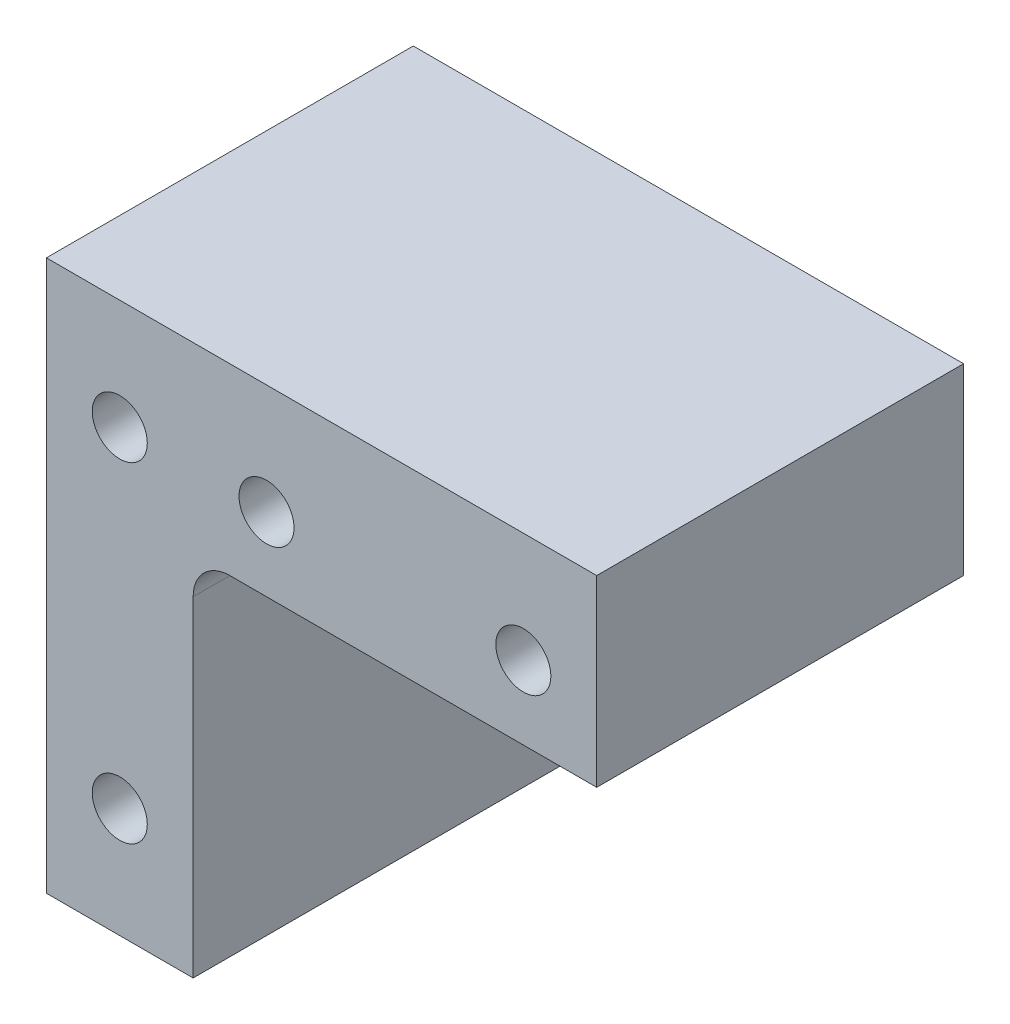
ISO-10303-21;
HEADER;
FILE_DESCRIPTION(('STEP AP214'),'2;1');
FILE_NAME('part.step','',(''),(''),'','','');
FILE_SCHEMA(('AUTOMOTIVE_DESIGN { 1 0 10303 214 1 1 1 1 }'));
ENDSEC;
DATA;
#1=APPLICATION_CONTEXT('core data for automotive mechanical design processes');
#2=APPLICATION_PROTOCOL_DEFINITION('international standard','automotive_design',2000,#1);
#3=PRODUCT_CONTEXT('',#1,'mechanical');
#4=PRODUCT('Part','Part','',(#3));
#5=PRODUCT_RELATED_PRODUCT_CATEGORY('part','',(#4));
#6=PRODUCT_DEFINITION_FORMATION('','',#4);
#7=PRODUCT_DEFINITION_CONTEXT('part definition',#1,'design');
#8=PRODUCT_DEFINITION('design','',#6,#7);
#9=PRODUCT_DEFINITION_SHAPE('','',#8);
#10=(LENGTH_UNIT() NAMED_UNIT(*) SI_UNIT(.MILLI.,.METRE.));
#11=(NAMED_UNIT(*) PLANE_ANGLE_UNIT() SI_UNIT($,.RADIAN.));
#12=(NAMED_UNIT(*) SI_UNIT($,.STERADIAN.) SOLID_ANGLE_UNIT());
#13=UNCERTAINTY_MEASURE_WITH_UNIT(LENGTH_MEASURE(1.E-05),#10,'distance_accuracy_value','');
#14=(GEOMETRIC_REPRESENTATION_CONTEXT(3) GLOBAL_UNCERTAINTY_ASSIGNED_CONTEXT((#13)) GLOBAL_UNIT_ASSIGNED_CONTEXT((#10,
#11,#12)) REPRESENTATION_CONTEXT('',''));
#15=CARTESIAN_POINT('',(0.,0.,0.));
#16=DIRECTION('',(0.,0.,1.));
#17=DIRECTION('',(1.,0.,0.));
#18=AXIS2_PLACEMENT_3D('',#15,#16,#17);
#19=CARTESIAN_POINT('',(12.7,22.86,25.4));
#20=DIRECTION('',(0.,0.,1.));
#21=DIRECTION('',(1.,0.,0.));
#22=AXIS2_PLACEMENT_3D('',#19,#20,#21);
#23=PLANE('',#22);
#24=CARTESIAN_POINT('',(15.24,30.48,25.4));
#25=DIRECTION('',(0.,0.,1.));
#26=DIRECTION('',(1.,0.,0.));
#27=AXIS2_PLACEMENT_3D('',#24,#25,#26);
#28=CIRCLE('',#27,1.905);
#29=CARTESIAN_POINT('',(17.145,30.48,25.4));
#30=VERTEX_POINT('',#29);
#31=EDGE_CURVE('E170',#30,#30,#28,.T.);
#32=ORIENTED_EDGE('',*,*,#31,.F.);
#33=EDGE_LOOP('',(#32));
#34=FACE_BOUND('',#33,.T.);
#35=CARTESIAN_POINT('',(5.08,30.48,25.4));
#36=DIRECTION('',(0.,0.,1.));
#37=DIRECTION('',(1.,0.,0.));
#38=AXIS2_PLACEMENT_3D('',#35,#36,#37);
#39=CIRCLE('',#38,1.905);
#40=CARTESIAN_POINT('',(6.985,30.48,25.4));
#41=VERTEX_POINT('',#40);
#42=EDGE_CURVE('E128',#41,#41,#39,.T.);
#43=ORIENTED_EDGE('',*,*,#42,.F.);
#44=EDGE_LOOP('',(#43));
#45=FACE_BOUND('',#44,.T.);
#46=DIRECTION('',(1.,0.,0.));
#47=VECTOR('',#46,1.);
#48=CARTESIAN_POINT('',(10.16,0.,25.4));
#49=LINE('',#48,#47);
#50=CARTESIAN_POINT('',(0.,0.,25.4));
#51=VERTEX_POINT('',#50);
#52=CARTESIAN_POINT('',(10.16,0.,25.4));
#53=VERTEX_POINT('',#52);
#54=EDGE_CURVE('E137',#51,#53,#49,.T.);
#55=ORIENTED_EDGE('',*,*,#54,.T.);
#56=DIRECTION('',(0.,1.,0.));
#57=VECTOR('',#56,1.);
#58=CARTESIAN_POINT('',(10.16,22.86,25.4));
#59=LINE('',#58,#57);
#60=CARTESIAN_POINT('',(10.16,22.86,25.4));
#61=VERTEX_POINT('',#60);
#62=EDGE_CURVE('E90',#53,#61,#59,.T.);
#63=ORIENTED_EDGE('',*,*,#62,.T.);
#64=CARTESIAN_POINT('',(12.7,22.86,25.4));
#65=DIRECTION('',(0.,0.,-1.));
#66=DIRECTION('',(1.,0.,0.));
#67=AXIS2_PLACEMENT_3D('',#64,#65,#66);
#68=CIRCLE('',#67,2.54);
#69=CARTESIAN_POINT('',(12.7,25.4,25.4));
#70=VERTEX_POINT('',#69);
#71=EDGE_CURVE('E149',#61,#70,#68,.T.);
#72=ORIENTED_EDGE('',*,*,#71,.T.);
#73=DIRECTION('',(1.,0.,0.));
#74=VECTOR('',#73,1.);
#75=CARTESIAN_POINT('',(38.1,25.4,25.4));
#76=LINE('',#75,#74);
#77=CARTESIAN_POINT('',(38.1,25.4,25.4));
#78=VERTEX_POINT('',#77);
#79=EDGE_CURVE('E106',#70,#78,#76,.T.);
#80=ORIENTED_EDGE('',*,*,#79,.T.);
#81=DIRECTION('',(0.,1.,0.));
#82=VECTOR('',#81,1.);
#83=CARTESIAN_POINT('',(38.1,38.1,25.4));
#84=LINE('',#83,#82);
#85=CARTESIAN_POINT('',(38.1,38.1,25.4));
#86=VERTEX_POINT('',#85);
#87=EDGE_CURVE('E100',#78,#86,#84,.T.);
#88=ORIENTED_EDGE('',*,*,#87,.T.);
#89=DIRECTION('',(-1.,0.,0.));
#90=VECTOR('',#89,1.);
#91=CARTESIAN_POINT('',(0.,38.1,25.4));
#92=LINE('',#91,#90);
#93=CARTESIAN_POINT('',(0.,38.1,25.4));
#94=VERTEX_POINT('',#93);
#95=EDGE_CURVE('E104',#86,#94,#92,.T.);
#96=ORIENTED_EDGE('',*,*,#95,.T.);
#97=DIRECTION('',(0.,-1.,0.));
#98=VECTOR('',#97,1.);
#99=CARTESIAN_POINT('',(0.,0.,25.4));
#100=LINE('',#99,#98);
#101=EDGE_CURVE('E50',#94,#51,#100,.T.);
#102=ORIENTED_EDGE('',*,*,#101,.T.);
#103=EDGE_LOOP('',(#55,#63,#72,#80,#88,#96,#102));
#104=FACE_BOUND('',#103,.T.);
#105=CARTESIAN_POINT('',(5.08,7.62,25.4));
#106=DIRECTION('',(0.,0.,1.));
#107=DIRECTION('',(1.,0.,0.));
#108=AXIS2_PLACEMENT_3D('',#105,#106,#107);
#109=CIRCLE('',#108,1.905);
#110=CARTESIAN_POINT('',(6.985,7.62,25.4));
#111=VERTEX_POINT('',#110);
#112=EDGE_CURVE('E164',#111,#111,#109,.T.);
#113=ORIENTED_EDGE('',*,*,#112,.F.);
#114=EDGE_LOOP('',(#113));
#115=FACE_BOUND('',#114,.T.);
#116=CARTESIAN_POINT('',(33.02,30.48,25.4));
#117=DIRECTION('',(0.,0.,1.));
#118=DIRECTION('',(1.,0.,0.));
#119=AXIS2_PLACEMENT_3D('',#116,#117,#118);
#120=CIRCLE('',#119,1.905);
#121=CARTESIAN_POINT('',(34.925,30.48,25.4));
#122=VERTEX_POINT('',#121);
#123=EDGE_CURVE('E176',#122,#122,#120,.T.);
#124=ORIENTED_EDGE('',*,*,#123,.F.);
#125=EDGE_LOOP('',(#124));
#126=FACE_BOUND('',#125,.T.);
#127=ADVANCED_FACE('F33',(#34,#45,#104,#115,#126),#23,.T.);
#128=CARTESIAN_POINT('',(12.7,22.86,0.));
#129=DIRECTION('',(0.,0.,1.));
#130=DIRECTION('',(1.,0.,0.));
#131=AXIS2_PLACEMENT_3D('',#128,#129,#130);
#132=PLANE('',#131);
#133=DIRECTION('',(1.,0.,0.));
#134=VECTOR('',#133,1.);
#135=CARTESIAN_POINT('',(10.16,0.,0.));
#136=LINE('',#135,#134);
#137=CARTESIAN_POINT('',(0.,0.,0.));
#138=VERTEX_POINT('',#137);
#139=CARTESIAN_POINT('',(10.16,0.,0.));
#140=VERTEX_POINT('',#139);
#141=EDGE_CURVE('E124',#138,#140,#136,.T.);
#142=ORIENTED_EDGE('',*,*,#141,.F.);
#143=DIRECTION('',(0.,-1.,0.));
#144=VECTOR('',#143,1.);
#145=CARTESIAN_POINT('',(0.,0.,0.));
#146=LINE('',#145,#144);
#147=CARTESIAN_POINT('',(0.,38.1,0.));
#148=VERTEX_POINT('',#147);
#149=EDGE_CURVE('E82',#148,#138,#146,.T.);
#150=ORIENTED_EDGE('',*,*,#149,.F.);
#151=DIRECTION('',(-1.,0.,0.));
#152=VECTOR('',#151,1.);
#153=CARTESIAN_POINT('',(0.,38.1,0.));
#154=LINE('',#153,#152);
#155=CARTESIAN_POINT('',(38.1,38.1,0.));
#156=VERTEX_POINT('',#155);
#157=EDGE_CURVE('E76',#156,#148,#154,.T.);
#158=ORIENTED_EDGE('',*,*,#157,.F.);
#159=DIRECTION('',(0.,1.,0.));
#160=VECTOR('',#159,1.);
#161=CARTESIAN_POINT('',(38.1,38.1,0.));
#162=LINE('',#161,#160);
#163=CARTESIAN_POINT('',(38.1,25.4,0.));
#164=VERTEX_POINT('',#163);
#165=EDGE_CURVE('E114',#164,#156,#162,.T.);
#166=ORIENTED_EDGE('',*,*,#165,.F.);
#167=DIRECTION('',(1.,0.,0.));
#168=VECTOR('',#167,1.);
#169=CARTESIAN_POINT('',(38.1,25.4,0.));
#170=LINE('',#169,#168);
#171=CARTESIAN_POINT('',(12.7,25.4,0.));
#172=VERTEX_POINT('',#171);
#173=EDGE_CURVE('E132',#172,#164,#170,.T.);
#174=ORIENTED_EDGE('',*,*,#173,.F.);
#175=CARTESIAN_POINT('',(12.7,22.86,0.));
#176=DIRECTION('',(0.,0.,-1.));
#177=DIRECTION('',(1.,0.,0.));
#178=AXIS2_PLACEMENT_3D('',#175,#176,#177);
#179=CIRCLE('',#178,2.54);
#180=CARTESIAN_POINT('',(10.16,22.86,0.));
#181=VERTEX_POINT('',#180);
#182=EDGE_CURVE('E130',#181,#172,#179,.T.);
#183=ORIENTED_EDGE('',*,*,#182,.F.);
#184=DIRECTION('',(0.,1.,0.));
#185=VECTOR('',#184,1.);
#186=CARTESIAN_POINT('',(10.16,22.86,0.));
#187=LINE('',#186,#185);
#188=EDGE_CURVE('E127',#140,#181,#187,.T.);
#189=ORIENTED_EDGE('',*,*,#188,.F.);
#190=EDGE_LOOP('',(#142,#150,#158,#166,#174,#183,#189));
#191=FACE_BOUND('',#190,.T.);
#192=CARTESIAN_POINT('',(5.08,30.48,0.));
#193=DIRECTION('',(0.,0.,1.));
#194=DIRECTION('',(1.,0.,0.));
#195=AXIS2_PLACEMENT_3D('',#192,#193,#194);
#196=CIRCLE('',#195,1.905);
#197=CARTESIAN_POINT('',(6.985,30.48,0.));
#198=VERTEX_POINT('',#197);
#199=EDGE_CURVE('E161',#198,#198,#196,.T.);
#200=ORIENTED_EDGE('',*,*,#199,.T.);
#201=EDGE_LOOP('',(#200));
#202=FACE_BOUND('',#201,.T.);
#203=CARTESIAN_POINT('',(5.08,7.62,0.));
#204=DIRECTION('',(0.,0.,1.));
#205=DIRECTION('',(1.,0.,0.));
#206=AXIS2_PLACEMENT_3D('',#203,#204,#205);
#207=CIRCLE('',#206,1.905);
#208=CARTESIAN_POINT('',(6.985,7.62,0.));
#209=VERTEX_POINT('',#208);
#210=EDGE_CURVE('E167',#209,#209,#207,.T.);
#211=ORIENTED_EDGE('',*,*,#210,.T.);
#212=EDGE_LOOP('',(#211));
#213=FACE_BOUND('',#212,.T.);
#214=CARTESIAN_POINT('',(15.24,30.48,0.));
#215=DIRECTION('',(0.,0.,1.));
#216=DIRECTION('',(1.,0.,0.));
#217=AXIS2_PLACEMENT_3D('',#214,#215,#216);
#218=CIRCLE('',#217,1.905);
#219=CARTESIAN_POINT('',(17.145,30.48,0.));
#220=VERTEX_POINT('',#219);
#221=EDGE_CURVE('E173',#220,#220,#218,.T.);
#222=ORIENTED_EDGE('',*,*,#221,.T.);
#223=EDGE_LOOP('',(#222));
#224=FACE_BOUND('',#223,.T.);
#225=CARTESIAN_POINT('',(33.02,30.48,0.));
#226=DIRECTION('',(0.,0.,1.));
#227=DIRECTION('',(1.,0.,0.));
#228=AXIS2_PLACEMENT_3D('',#225,#226,#227);
#229=CIRCLE('',#228,1.905);
#230=CARTESIAN_POINT('',(34.925,30.48,0.));
#231=VERTEX_POINT('',#230);
#232=EDGE_CURVE('E179',#231,#231,#229,.T.);
#233=ORIENTED_EDGE('',*,*,#232,.T.);
#234=EDGE_LOOP('',(#233));
#235=FACE_BOUND('',#234,.T.);
#236=ADVANCED_FACE('F153',(#191,#202,#213,#224,#235),#132,.F.);
#237=CARTESIAN_POINT('',(10.16,0.,25.4));
#238=DIRECTION('',(0.,1.,0.));
#239=DIRECTION('',(0.,0.,1.));
#240=AXIS2_PLACEMENT_3D('',#237,#238,#239);
#241=PLANE('',#240);
#242=ORIENTED_EDGE('',*,*,#141,.T.);
#243=DIRECTION('',(0.,0.,-1.));
#244=VECTOR('',#243,1.);
#245=CARTESIAN_POINT('',(10.16,0.,25.4));
#246=LINE('',#245,#244);
#247=EDGE_CURVE('E11',#53,#140,#246,.T.);
#248=ORIENTED_EDGE('',*,*,#247,.F.);
#249=ORIENTED_EDGE('',*,*,#54,.F.);
#250=DIRECTION('',(0.,0.,-1.));
#251=VECTOR('',#250,1.);
#252=CARTESIAN_POINT('',(0.,0.,25.4));
#253=LINE('',#252,#251);
#254=EDGE_CURVE('E120',#51,#138,#253,.T.);
#255=ORIENTED_EDGE('',*,*,#254,.T.);
#256=EDGE_LOOP('',(#242,#248,#249,#255));
#257=FACE_BOUND('',#256,.T.);
#258=ADVANCED_FACE('F35',(#257),#241,.F.);
#259=CARTESIAN_POINT('',(10.16,22.86,25.4));
#260=DIRECTION('',(-1.,0.,0.));
#261=DIRECTION('',(0.,-1.,0.));
#262=AXIS2_PLACEMENT_3D('',#259,#260,#261);
#263=PLANE('',#262);
#264=ORIENTED_EDGE('',*,*,#188,.T.);
#265=DIRECTION('',(0.,0.,-1.));
#266=VECTOR('',#265,1.);
#267=CARTESIAN_POINT('',(10.16,22.86,25.4));
#268=LINE('',#267,#266);
#269=EDGE_CURVE('E42',#61,#181,#268,.T.);
#270=ORIENTED_EDGE('',*,*,#269,.F.);
#271=ORIENTED_EDGE('',*,*,#62,.F.);
#272=ORIENTED_EDGE('',*,*,#247,.T.);
#273=EDGE_LOOP('',(#264,#270,#271,#272));
#274=FACE_BOUND('',#273,.T.);
#275=ADVANCED_FACE('F211',(#274),#263,.F.);
#276=CARTESIAN_POINT('',(12.7,22.86,25.4));
#277=DIRECTION('',(0.,0.,-1.));
#278=DIRECTION('',(-1.,0.,0.));
#279=AXIS2_PLACEMENT_3D('',#276,#277,#278);
#280=CYLINDRICAL_SURFACE('',#279,2.54);
#281=ORIENTED_EDGE('',*,*,#182,.T.);
#282=DIRECTION('',(0.,0.,-1.));
#283=VECTOR('',#282,1.);
#284=CARTESIAN_POINT('',(12.7,25.4,25.4));
#285=LINE('',#284,#283);
#286=EDGE_CURVE('E141',#70,#172,#285,.T.);
#287=ORIENTED_EDGE('',*,*,#286,.F.);
#288=ORIENTED_EDGE('',*,*,#71,.F.);
#289=ORIENTED_EDGE('',*,*,#269,.T.);
#290=EDGE_LOOP('',(#281,#287,#288,#289));
#291=FACE_BOUND('',#290,.T.);
#292=ADVANCED_FACE('F147',(#291),#280,.F.);
#293=CARTESIAN_POINT('',(38.1,25.4,25.4));
#294=DIRECTION('',(0.,1.,0.));
#295=DIRECTION('',(-1.,0.,0.));
#296=AXIS2_PLACEMENT_3D('',#293,#294,#295);
#297=PLANE('',#296);
#298=ORIENTED_EDGE('',*,*,#173,.T.);
#299=DIRECTION('',(0.,0.,-1.));
#300=VECTOR('',#299,1.);
#301=CARTESIAN_POINT('',(38.1,25.4,25.4));
#302=LINE('',#301,#300);
#303=EDGE_CURVE('E115',#78,#164,#302,.T.);
#304=ORIENTED_EDGE('',*,*,#303,.F.);
#305=ORIENTED_EDGE('',*,*,#79,.F.);
#306=ORIENTED_EDGE('',*,*,#286,.T.);
#307=EDGE_LOOP('',(#298,#304,#305,#306));
#308=FACE_BOUND('',#307,.T.);
#309=ADVANCED_FACE('F156',(#308),#297,.F.);
#310=CARTESIAN_POINT('',(38.1,38.1,25.4));
#311=DIRECTION('',(-1.,0.,0.));
#312=DIRECTION('',(0.,-1.,0.));
#313=AXIS2_PLACEMENT_3D('',#310,#311,#312);
#314=PLANE('',#313);
#315=ORIENTED_EDGE('',*,*,#165,.T.);
#316=DIRECTION('',(0.,0.,-1.));
#317=VECTOR('',#316,1.);
#318=CARTESIAN_POINT('',(38.1,38.1,25.4));
#319=LINE('',#318,#317);
#320=EDGE_CURVE('E111',#86,#156,#319,.T.);
#321=ORIENTED_EDGE('',*,*,#320,.F.);
#322=ORIENTED_EDGE('',*,*,#87,.F.);
#323=ORIENTED_EDGE('',*,*,#303,.T.);
#324=EDGE_LOOP('',(#315,#321,#322,#323));
#325=FACE_BOUND('',#324,.T.);
#326=ADVANCED_FACE('F112',(#325),#314,.F.);
#327=CARTESIAN_POINT('',(0.,38.1,25.4));
#328=DIRECTION('',(0.,-1.,0.));
#329=DIRECTION('',(0.,0.,-1.));
#330=AXIS2_PLACEMENT_3D('',#327,#328,#329);
#331=PLANE('',#330);
#332=ORIENTED_EDGE('',*,*,#157,.T.);
#333=DIRECTION('',(0.,0.,-1.));
#334=VECTOR('',#333,1.);
#335=CARTESIAN_POINT('',(0.,38.1,25.4));
#336=LINE('',#335,#334);
#337=EDGE_CURVE('E116',#94,#148,#336,.T.);
#338=ORIENTED_EDGE('',*,*,#337,.F.);
#339=ORIENTED_EDGE('',*,*,#95,.F.);
#340=ORIENTED_EDGE('',*,*,#320,.T.);
#341=EDGE_LOOP('',(#332,#338,#339,#340));
#342=FACE_BOUND('',#341,.T.);
#343=ADVANCED_FACE('F118',(#342),#331,.F.);
#344=CARTESIAN_POINT('',(0.,0.,25.4));
#345=DIRECTION('',(1.,0.,0.));
#346=DIRECTION('',(0.,0.,-1.));
#347=AXIS2_PLACEMENT_3D('',#344,#345,#346);
#348=PLANE('',#347);
#349=ORIENTED_EDGE('',*,*,#149,.T.);
#350=ORIENTED_EDGE('',*,*,#254,.F.);
#351=ORIENTED_EDGE('',*,*,#101,.F.);
#352=ORIENTED_EDGE('',*,*,#337,.T.);
#353=EDGE_LOOP('',(#349,#350,#351,#352));
#354=FACE_BOUND('',#353,.T.);
#355=ADVANCED_FACE('F201',(#354),#348,.F.);
#356=CARTESIAN_POINT('',(5.08,30.48,25.4));
#357=DIRECTION('',(0.,0.,-1.));
#358=DIRECTION('',(-1.,0.,0.));
#359=AXIS2_PLACEMENT_3D('',#356,#357,#358);
#360=CYLINDRICAL_SURFACE('',#359,1.905);
#361=ORIENTED_EDGE('',*,*,#42,.T.);
#362=EDGE_LOOP('',(#361));
#363=FACE_BOUND('',#362,.T.);
#364=ORIENTED_EDGE('',*,*,#199,.F.);
#365=EDGE_LOOP('',(#364));
#366=FACE_BOUND('',#365,.T.);
#367=ADVANCED_FACE('F198',(#363,#366),#360,.F.);
#368=CARTESIAN_POINT('',(5.08,7.62,25.4));
#369=DIRECTION('',(0.,0.,-1.));
#370=DIRECTION('',(-1.,0.,0.));
#371=AXIS2_PLACEMENT_3D('',#368,#369,#370);
#372=CYLINDRICAL_SURFACE('',#371,1.905);
#373=ORIENTED_EDGE('',*,*,#112,.T.);
#374=EDGE_LOOP('',(#373));
#375=FACE_BOUND('',#374,.T.);
#376=ORIENTED_EDGE('',*,*,#210,.F.);
#377=EDGE_LOOP('',(#376));
#378=FACE_BOUND('',#377,.T.);
#379=ADVANCED_FACE('F270',(#375,#378),#372,.F.);
#380=CARTESIAN_POINT('',(15.24,30.48,25.4));
#381=DIRECTION('',(0.,0.,-1.));
#382=DIRECTION('',(-1.,0.,0.));
#383=AXIS2_PLACEMENT_3D('',#380,#381,#382);
#384=CYLINDRICAL_SURFACE('',#383,1.905);
#385=ORIENTED_EDGE('',*,*,#31,.T.);
#386=EDGE_LOOP('',(#385));
#387=FACE_BOUND('',#386,.T.);
#388=ORIENTED_EDGE('',*,*,#221,.F.);
#389=EDGE_LOOP('',(#388));
#390=FACE_BOUND('',#389,.T.);
#391=ADVANCED_FACE('F278',(#387,#390),#384,.F.);
#392=CARTESIAN_POINT('',(33.02,30.48,25.4));
#393=DIRECTION('',(0.,0.,-1.));
#394=DIRECTION('',(-1.,0.,0.));
#395=AXIS2_PLACEMENT_3D('',#392,#393,#394);
#396=CYLINDRICAL_SURFACE('',#395,1.905);
#397=ORIENTED_EDGE('',*,*,#123,.T.);
#398=EDGE_LOOP('',(#397));
#399=FACE_BOUND('',#398,.T.);
#400=ORIENTED_EDGE('',*,*,#232,.F.);
#401=EDGE_LOOP('',(#400));
#402=FACE_BOUND('',#401,.T.);
#403=ADVANCED_FACE('F185',(#399,#402),#396,.F.);
#404=CLOSED_SHELL('',(#127,#236,#258,#275,#292,#309,#326,#343,#355,#367,#379,#391,#403));
#405=MANIFOLD_SOLID_BREP('B2',#404);
#406=ADVANCED_BREP_SHAPE_REPRESENTATION('',(#18,#405),#14);
#407=SHAPE_DEFINITION_REPRESENTATION(#9,#406);
ENDSEC;
END-ISO-10303-21;
